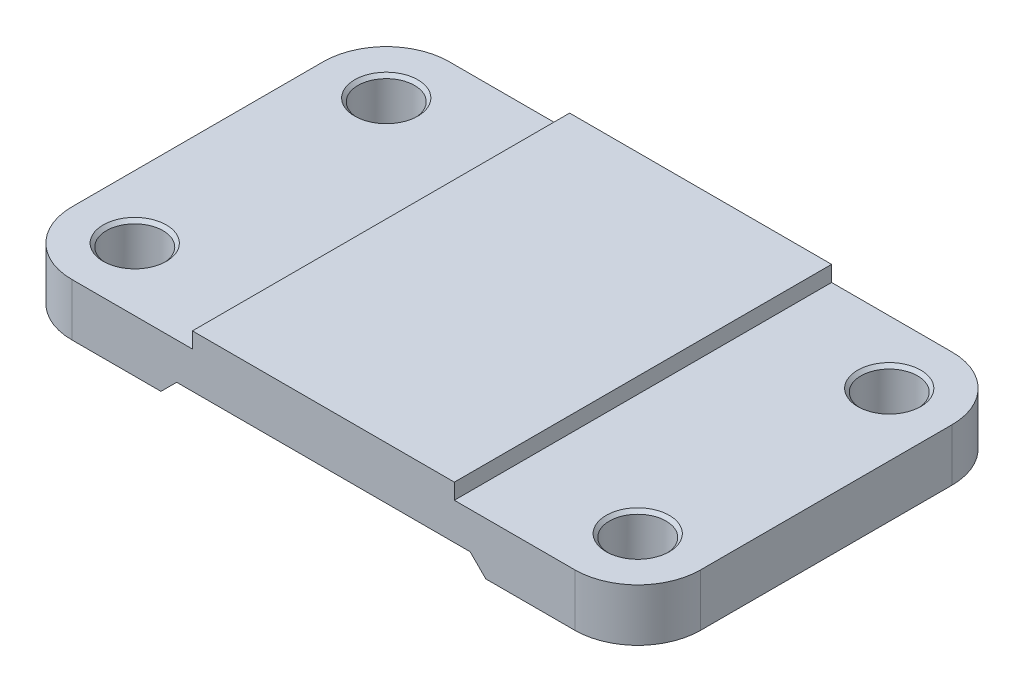
ISO-10303-21;
HEADER;
FILE_DESCRIPTION(('STEP AP214'),'2;1');
FILE_NAME('part.step','',(''),(''),'','','');
FILE_SCHEMA(('AUTOMOTIVE_DESIGN { 1 0 10303 214 1 1 1 1 }'));
ENDSEC;
DATA;
#1=APPLICATION_CONTEXT('core data for automotive mechanical design processes');
#2=APPLICATION_PROTOCOL_DEFINITION('international standard','automotive_design',2000,#1);
#3=PRODUCT_CONTEXT('',#1,'mechanical');
#4=PRODUCT('Part','Part','',(#3));
#5=PRODUCT_RELATED_PRODUCT_CATEGORY('part','',(#4));
#6=PRODUCT_DEFINITION_FORMATION('','',#4);
#7=PRODUCT_DEFINITION_CONTEXT('part definition',#1,'design');
#8=PRODUCT_DEFINITION('design','',#6,#7);
#9=PRODUCT_DEFINITION_SHAPE('','',#8);
#10=(LENGTH_UNIT() NAMED_UNIT(*) SI_UNIT(.MILLI.,.METRE.));
#11=(NAMED_UNIT(*) PLANE_ANGLE_UNIT() SI_UNIT($,.RADIAN.));
#12=(NAMED_UNIT(*) SI_UNIT($,.STERADIAN.) SOLID_ANGLE_UNIT());
#13=UNCERTAINTY_MEASURE_WITH_UNIT(LENGTH_MEASURE(1.E-05),#10,'distance_accuracy_value','');
#14=(GEOMETRIC_REPRESENTATION_CONTEXT(3) GLOBAL_UNCERTAINTY_ASSIGNED_CONTEXT((#13)) GLOBAL_UNIT_ASSIGNED_CONTEXT((#10,
#11,#12)) REPRESENTATION_CONTEXT('',''));
#15=CARTESIAN_POINT('',(0.,0.,0.));
#16=DIRECTION('',(0.,0.,1.));
#17=DIRECTION('',(1.,0.,0.));
#18=AXIS2_PLACEMENT_3D('',#15,#16,#17);
#19=CARTESIAN_POINT('',(-28.,3.00000000000001,36.));
#20=DIRECTION('',(0.,1.,0.));
#21=DIRECTION('',(0.,0.,1.));
#22=AXIS2_PLACEMENT_3D('',#19,#20,#21);
#23=PLANE('',#22);
#24=DIRECTION('',(1.,0.,0.));
#25=VECTOR('',#24,1.);
#26=CARTESIAN_POINT('',(-28.,3.00000000000001,-36.));
#27=LINE('',#26,#25);
#28=CARTESIAN_POINT('',(-28.,3.00000000000001,-36.));
#29=VERTEX_POINT('',#28);
#30=CARTESIAN_POINT('',(28.,3.00000000000001,-36.));
#31=VERTEX_POINT('',#30);
#32=EDGE_CURVE('E191',#29,#31,#27,.T.);
#33=ORIENTED_EDGE('',*,*,#32,.T.);
#34=DIRECTION('',(0.,0.,-1.));
#35=VECTOR('',#34,1.);
#36=CARTESIAN_POINT('',(28.,3.00000000000001,36.));
#37=LINE('',#36,#35);
#38=CARTESIAN_POINT('',(28.,3.00000000000001,36.));
#39=VERTEX_POINT('',#38);
#40=EDGE_CURVE('E171',#39,#31,#37,.T.);
#41=ORIENTED_EDGE('',*,*,#40,.F.);
#42=DIRECTION('',(1.,0.,0.));
#43=VECTOR('',#42,1.);
#44=CARTESIAN_POINT('',(-28.,3.00000000000001,36.));
#45=LINE('',#44,#43);
#46=CARTESIAN_POINT('',(-28.,3.00000000000001,36.));
#47=VERTEX_POINT('',#46);
#48=EDGE_CURVE('E178',#47,#39,#45,.T.);
#49=ORIENTED_EDGE('',*,*,#48,.F.);
#50=DIRECTION('',(0.,0.,-1.));
#51=VECTOR('',#50,1.);
#52=CARTESIAN_POINT('',(-28.,3.00000000000001,36.));
#53=LINE('',#52,#51);
#54=EDGE_CURVE('E307',#47,#29,#53,.T.);
#55=ORIENTED_EDGE('',*,*,#54,.T.);
#56=EDGE_LOOP('',(#33,#41,#49,#55));
#57=FACE_BOUND('',#56,.T.);
#58=ADVANCED_FACE('F49',(#57),#23,.F.);
#59=CARTESIAN_POINT('',(28.,3.00000000000001,36.));
#60=DIRECTION('',(0.707106781186549,0.707106781186546,0.));
#61=DIRECTION('',(-0.707106781186546,0.707106781186549,0.));
#62=AXIS2_PLACEMENT_3D('',#59,#60,#61);
#63=PLANE('',#62);
#64=DIRECTION('',(0.707106781186546,-0.707106781186549,0.));
#65=VECTOR('',#64,1.);
#66=CARTESIAN_POINT('',(28.,3.00000000000001,-36.));
#67=LINE('',#66,#65);
#68=CARTESIAN_POINT('',(31.,0.,-36.));
#69=VERTEX_POINT('',#68);
#70=EDGE_CURVE('E310',#31,#69,#67,.T.);
#71=ORIENTED_EDGE('',*,*,#70,.T.);
#72=DIRECTION('',(0.,0.,-1.));
#73=VECTOR('',#72,1.);
#74=CARTESIAN_POINT('',(31.,0.,36.));
#75=LINE('',#74,#73);
#76=CARTESIAN_POINT('',(31.,0.,36.));
#77=VERTEX_POINT('',#76);
#78=EDGE_CURVE('E174',#77,#69,#75,.T.);
#79=ORIENTED_EDGE('',*,*,#78,.F.);
#80=DIRECTION('',(0.707106781186546,-0.707106781186549,0.));
#81=VECTOR('',#80,1.);
#82=CARTESIAN_POINT('',(28.,3.00000000000001,36.));
#83=LINE('',#82,#81);
#84=EDGE_CURVE('E167',#39,#77,#83,.T.);
#85=ORIENTED_EDGE('',*,*,#84,.F.);
#86=ORIENTED_EDGE('',*,*,#40,.T.);
#87=EDGE_LOOP('',(#71,#79,#85,#86));
#88=FACE_BOUND('',#87,.T.);
#89=ADVANCED_FACE('F169',(#88),#63,.F.);
#90=CARTESIAN_POINT('',(31.,0.,36.));
#91=DIRECTION('',(0.,1.,0.));
#92=DIRECTION('',(-1.,0.,0.));
#93=AXIS2_PLACEMENT_3D('',#90,#91,#92);
#94=PLANE('',#93);
#95=CARTESIAN_POINT('',(48.,0.,24.));
#96=DIRECTION('',(0.,1.,0.));
#97=DIRECTION('',(-1.,0.,0.));
#98=AXIS2_PLACEMENT_3D('',#95,#96,#97);
#99=CIRCLE('',#98,5.4);
#100=CARTESIAN_POINT('',(42.6,0.,24.));
#101=VERTEX_POINT('',#100);
#102=EDGE_CURVE('E249',#101,#101,#99,.T.);
#103=ORIENTED_EDGE('',*,*,#102,.T.);
#104=EDGE_LOOP('',(#103));
#105=FACE_BOUND('',#104,.T.);
#106=CARTESIAN_POINT('',(48.,0.,-24.));
#107=DIRECTION('',(0.,1.,0.));
#108=DIRECTION('',(-1.,0.,0.));
#109=AXIS2_PLACEMENT_3D('',#106,#107,#108);
#110=CIRCLE('',#109,5.4);
#111=CARTESIAN_POINT('',(42.6,0.,-24.));
#112=VERTEX_POINT('',#111);
#113=EDGE_CURVE('E244',#112,#112,#110,.T.);
#114=ORIENTED_EDGE('',*,*,#113,.T.);
#115=EDGE_LOOP('',(#114));
#116=FACE_BOUND('',#115,.T.);
#117=DIRECTION('',(1.,0.,0.));
#118=VECTOR('',#117,1.);
#119=CARTESIAN_POINT('',(31.,0.,-36.));
#120=LINE('',#119,#118);
#121=CARTESIAN_POINT('',(48.,0.,-36.));
#122=VERTEX_POINT('',#121);
#123=EDGE_CURVE('E313',#69,#122,#120,.T.);
#124=ORIENTED_EDGE('',*,*,#123,.T.);
#125=CARTESIAN_POINT('',(48.,0.,-24.));
#126=DIRECTION('',(0.,1.,0.));
#127=DIRECTION('',(-1.,0.,0.));
#128=AXIS2_PLACEMENT_3D('',#125,#126,#127);
#129=CIRCLE('',#128,12.);
#130=CARTESIAN_POINT('',(60.,0.,-24.));
#131=VERTEX_POINT('',#130);
#132=EDGE_CURVE('E238',#122,#131,#129,.F.);
#133=ORIENTED_EDGE('',*,*,#132,.T.);
#134=DIRECTION('',(0.,0.,-1.));
#135=VECTOR('',#134,1.);
#136=CARTESIAN_POINT('',(60.,0.,36.));
#137=LINE('',#136,#135);
#138=CARTESIAN_POINT('',(60.,0.,24.));
#139=VERTEX_POINT('',#138);
#140=EDGE_CURVE('E199',#139,#131,#137,.T.);
#141=ORIENTED_EDGE('',*,*,#140,.F.);
#142=CARTESIAN_POINT('',(48.,0.,24.));
#143=DIRECTION('',(0.,1.,0.));
#144=DIRECTION('',(-1.,0.,0.));
#145=AXIS2_PLACEMENT_3D('',#142,#143,#144);
#146=CIRCLE('',#145,12.);
#147=CARTESIAN_POINT('',(48.,0.,36.));
#148=VERTEX_POINT('',#147);
#149=EDGE_CURVE('E67',#139,#148,#146,.F.);
#150=ORIENTED_EDGE('',*,*,#149,.T.);
#151=DIRECTION('',(1.,0.,0.));
#152=VECTOR('',#151,1.);
#153=CARTESIAN_POINT('',(31.,0.,36.));
#154=LINE('',#153,#152);
#155=EDGE_CURVE('E177',#77,#148,#154,.T.);
#156=ORIENTED_EDGE('',*,*,#155,.F.);
#157=ORIENTED_EDGE('',*,*,#78,.T.);
#158=EDGE_LOOP('',(#124,#133,#141,#150,#156,#157));
#159=FACE_BOUND('',#158,.T.);
#160=ADVANCED_FACE('F418',(#105,#116,#159),#94,.F.);
#161=CARTESIAN_POINT('',(60.,0.,36.));
#162=DIRECTION('',(-1.,0.,0.));
#163=DIRECTION('',(0.,0.,1.));
#164=AXIS2_PLACEMENT_3D('',#161,#162,#163);
#165=PLANE('',#164);
#166=ORIENTED_EDGE('',*,*,#140,.T.);
#167=DIRECTION('',(0.,1.,0.));
#168=VECTOR('',#167,1.);
#169=CARTESIAN_POINT('',(60.,0.,-24.));
#170=LINE('',#169,#168);
#171=CARTESIAN_POINT('',(60.,9.99999999999999,-24.));
#172=VERTEX_POINT('',#171);
#173=EDGE_CURVE('E227',#131,#172,#170,.T.);
#174=ORIENTED_EDGE('',*,*,#173,.T.);
#175=DIRECTION('',(0.,0.,-1.));
#176=VECTOR('',#175,1.);
#177=CARTESIAN_POINT('',(60.,9.99999999999999,36.));
#178=LINE('',#177,#176);
#179=CARTESIAN_POINT('',(60.,9.99999999999999,24.));
#180=VERTEX_POINT('',#179);
#181=EDGE_CURVE('E368',#180,#172,#178,.T.);
#182=ORIENTED_EDGE('',*,*,#181,.F.);
#183=DIRECTION('',(0.,1.,0.));
#184=VECTOR('',#183,1.);
#185=CARTESIAN_POINT('',(60.,0.,24.));
#186=LINE('',#185,#184);
#187=EDGE_CURVE('E224',#180,#139,#186,.F.);
#188=ORIENTED_EDGE('',*,*,#187,.T.);
#189=EDGE_LOOP('',(#166,#174,#182,#188));
#190=FACE_BOUND('',#189,.T.);
#191=ADVANCED_FACE('F375',(#190),#165,.F.);
#192=CARTESIAN_POINT('',(60.,9.99999999999999,36.));
#193=DIRECTION('',(0.,-1.,0.));
#194=DIRECTION('',(1.,0.,0.));
#195=AXIS2_PLACEMENT_3D('',#192,#193,#194);
#196=PLANE('',#195);
#197=CARTESIAN_POINT('',(48.,10.,24.));
#198=DIRECTION('',(0.,1.,0.));
#199=DIRECTION('',(0.,0.,1.));
#200=AXIS2_PLACEMENT_3D('',#197,#198,#199);
#201=CIRCLE('',#200,6.025);
#202=CARTESIAN_POINT('',(48.,10.,30.025));
#203=VERTEX_POINT('',#202);
#204=EDGE_CURVE('E257',#203,#203,#201,.T.);
#205=ORIENTED_EDGE('',*,*,#204,.F.);
#206=EDGE_LOOP('',(#205));
#207=FACE_BOUND('',#206,.T.);
#208=CARTESIAN_POINT('',(48.,10.,-24.));
#209=DIRECTION('',(0.,1.,0.));
#210=DIRECTION('',(0.,0.,1.));
#211=AXIS2_PLACEMENT_3D('',#208,#209,#210);
#212=CIRCLE('',#211,6.025);
#213=CARTESIAN_POINT('',(48.,10.,-17.975));
#214=VERTEX_POINT('',#213);
#215=EDGE_CURVE('E252',#214,#214,#212,.T.);
#216=ORIENTED_EDGE('',*,*,#215,.F.);
#217=EDGE_LOOP('',(#216));
#218=FACE_BOUND('',#217,.T.);
#219=ORIENTED_EDGE('',*,*,#181,.T.);
#220=CARTESIAN_POINT('',(48.,9.99999999999999,-24.));
#221=DIRECTION('',(0.,-1.,0.));
#222=DIRECTION('',(1.,0.,0.));
#223=AXIS2_PLACEMENT_3D('',#220,#221,#222);
#224=CIRCLE('',#223,12.);
#225=CARTESIAN_POINT('',(48.,9.99999999999999,-36.));
#226=VERTEX_POINT('',#225);
#227=EDGE_CURVE('E233',#172,#226,#224,.F.);
#228=ORIENTED_EDGE('',*,*,#227,.T.);
#229=DIRECTION('',(-1.,0.,0.));
#230=VECTOR('',#229,1.);
#231=CARTESIAN_POINT('',(60.,9.99999999999999,-36.));
#232=LINE('',#231,#230);
#233=CARTESIAN_POINT('',(25.,9.99999999999999,-36.));
#234=VERTEX_POINT('',#233);
#235=EDGE_CURVE('E317',#226,#234,#232,.T.);
#236=ORIENTED_EDGE('',*,*,#235,.T.);
#237=DIRECTION('',(0.,0.,-1.));
#238=VECTOR('',#237,1.);
#239=CARTESIAN_POINT('',(25.,9.99999999999999,36.));
#240=LINE('',#239,#238);
#241=CARTESIAN_POINT('',(25.,9.99999999999999,36.));
#242=VERTEX_POINT('',#241);
#243=EDGE_CURVE('E364',#242,#234,#240,.T.);
#244=ORIENTED_EDGE('',*,*,#243,.F.);
#245=DIRECTION('',(-1.,0.,0.));
#246=VECTOR('',#245,1.);
#247=CARTESIAN_POINT('',(60.,9.99999999999999,36.));
#248=LINE('',#247,#246);
#249=CARTESIAN_POINT('',(48.,9.99999999999999,36.));
#250=VERTEX_POINT('',#249);
#251=EDGE_CURVE('E286',#250,#242,#248,.T.);
#252=ORIENTED_EDGE('',*,*,#251,.F.);
#253=CARTESIAN_POINT('',(48.,9.99999999999999,24.));
#254=DIRECTION('',(0.,-1.,0.));
#255=DIRECTION('',(1.,0.,0.));
#256=AXIS2_PLACEMENT_3D('',#253,#254,#255);
#257=CIRCLE('',#256,12.);
#258=EDGE_CURVE('E75',#250,#180,#257,.F.);
#259=ORIENTED_EDGE('',*,*,#258,.T.);
#260=EDGE_LOOP('',(#219,#228,#236,#244,#252,#259));
#261=FACE_BOUND('',#260,.T.);
#262=ADVANCED_FACE('F383',(#207,#218,#261),#196,.F.);
#263=CARTESIAN_POINT('',(25.,9.99999999999999,36.));
#264=DIRECTION('',(-1.,0.,0.));
#265=DIRECTION('',(0.,0.,1.));
#266=AXIS2_PLACEMENT_3D('',#263,#264,#265);
#267=PLANE('',#266);
#268=DIRECTION('',(0.,1.,0.));
#269=VECTOR('',#268,1.);
#270=CARTESIAN_POINT('',(25.,9.99999999999999,-36.));
#271=LINE('',#270,#269);
#272=CARTESIAN_POINT('',(25.,13.,-36.));
#273=VERTEX_POINT('',#272);
#274=EDGE_CURVE('E320',#234,#273,#271,.T.);
#275=ORIENTED_EDGE('',*,*,#274,.T.);
#276=DIRECTION('',(0.,0.,-1.));
#277=VECTOR('',#276,1.);
#278=CARTESIAN_POINT('',(25.,13.,36.));
#279=LINE('',#278,#277);
#280=CARTESIAN_POINT('',(25.,13.,36.));
#281=VERTEX_POINT('',#280);
#282=EDGE_CURVE('E360',#281,#273,#279,.T.);
#283=ORIENTED_EDGE('',*,*,#282,.F.);
#284=DIRECTION('',(0.,1.,0.));
#285=VECTOR('',#284,1.);
#286=CARTESIAN_POINT('',(25.,9.99999999999999,36.));
#287=LINE('',#286,#285);
#288=EDGE_CURVE('E289',#242,#281,#287,.T.);
#289=ORIENTED_EDGE('',*,*,#288,.F.);
#290=ORIENTED_EDGE('',*,*,#243,.T.);
#291=EDGE_LOOP('',(#275,#283,#289,#290));
#292=FACE_BOUND('',#291,.T.);
#293=ADVANCED_FACE('F394',(#292),#267,.F.);
#294=CARTESIAN_POINT('',(-25.,13.,36.));
#295=DIRECTION('',(0.,-1.,0.));
#296=DIRECTION('',(0.,0.,-1.));
#297=AXIS2_PLACEMENT_3D('',#294,#295,#296);
#298=PLANE('',#297);
#299=DIRECTION('',(-1.,0.,0.));
#300=VECTOR('',#299,1.);
#301=CARTESIAN_POINT('',(-25.,13.,-36.));
#302=LINE('',#301,#300);
#303=CARTESIAN_POINT('',(-25.,13.,-36.));
#304=VERTEX_POINT('',#303);
#305=EDGE_CURVE('E323',#273,#304,#302,.T.);
#306=ORIENTED_EDGE('',*,*,#305,.T.);
#307=DIRECTION('',(0.,0.,-1.));
#308=VECTOR('',#307,1.);
#309=CARTESIAN_POINT('',(-25.,13.,36.));
#310=LINE('',#309,#308);
#311=CARTESIAN_POINT('',(-25.,13.,36.));
#312=VERTEX_POINT('',#311);
#313=EDGE_CURVE('E356',#312,#304,#310,.T.);
#314=ORIENTED_EDGE('',*,*,#313,.F.);
#315=DIRECTION('',(-1.,0.,0.));
#316=VECTOR('',#315,1.);
#317=CARTESIAN_POINT('',(-25.,13.,36.));
#318=LINE('',#317,#316);
#319=EDGE_CURVE('E292',#281,#312,#318,.T.);
#320=ORIENTED_EDGE('',*,*,#319,.F.);
#321=ORIENTED_EDGE('',*,*,#282,.T.);
#322=EDGE_LOOP('',(#306,#314,#320,#321));
#323=FACE_BOUND('',#322,.T.);
#324=ADVANCED_FACE('F398',(#323),#298,.F.);
#325=CARTESIAN_POINT('',(-25.,9.99999999999999,36.));
#326=DIRECTION('',(1.,0.,0.));
#327=DIRECTION('',(0.,0.,-1.));
#328=AXIS2_PLACEMENT_3D('',#325,#326,#327);
#329=PLANE('',#328);
#330=DIRECTION('',(0.,-1.,0.));
#331=VECTOR('',#330,1.);
#332=CARTESIAN_POINT('',(-25.,9.99999999999999,-36.));
#333=LINE('',#332,#331);
#334=CARTESIAN_POINT('',(-25.,9.99999999999999,-36.));
#335=VERTEX_POINT('',#334);
#336=EDGE_CURVE('E326',#304,#335,#333,.T.);
#337=ORIENTED_EDGE('',*,*,#336,.T.);
#338=DIRECTION('',(0.,0.,-1.));
#339=VECTOR('',#338,1.);
#340=CARTESIAN_POINT('',(-25.,9.99999999999999,36.));
#341=LINE('',#340,#339);
#342=CARTESIAN_POINT('',(-25.,9.99999999999999,36.));
#343=VERTEX_POINT('',#342);
#344=EDGE_CURVE('E352',#343,#335,#341,.T.);
#345=ORIENTED_EDGE('',*,*,#344,.F.);
#346=DIRECTION('',(0.,-1.,0.));
#347=VECTOR('',#346,1.);
#348=CARTESIAN_POINT('',(-25.,9.99999999999999,36.));
#349=LINE('',#348,#347);
#350=EDGE_CURVE('E295',#312,#343,#349,.T.);
#351=ORIENTED_EDGE('',*,*,#350,.F.);
#352=ORIENTED_EDGE('',*,*,#313,.T.);
#353=EDGE_LOOP('',(#337,#345,#351,#352));
#354=FACE_BOUND('',#353,.T.);
#355=ADVANCED_FACE('F464',(#354),#329,.F.);
#356=CARTESIAN_POINT('',(-60.,9.99999999999999,36.));
#357=DIRECTION('',(0.,-1.,0.));
#358=DIRECTION('',(1.,0.,0.));
#359=AXIS2_PLACEMENT_3D('',#356,#357,#358);
#360=PLANE('',#359);
#361=CARTESIAN_POINT('',(-48.,9.99999999999999,-24.));
#362=DIRECTION('',(0.,1.,0.));
#363=DIRECTION('',(0.,0.,1.));
#364=AXIS2_PLACEMENT_3D('',#361,#362,#363);
#365=CIRCLE('',#364,6.025);
#366=CARTESIAN_POINT('',(-48.,9.99999999999999,-17.975));
#367=VERTEX_POINT('',#366);
#368=EDGE_CURVE('E518',#367,#367,#365,.T.);
#369=ORIENTED_EDGE('',*,*,#368,.F.);
#370=EDGE_LOOP('',(#369));
#371=FACE_BOUND('',#370,.T.);
#372=CARTESIAN_POINT('',(-48.,9.99999999999999,24.));
#373=DIRECTION('',(0.,1.,0.));
#374=DIRECTION('',(0.,0.,1.));
#375=AXIS2_PLACEMENT_3D('',#372,#373,#374);
#376=CIRCLE('',#375,6.025);
#377=CARTESIAN_POINT('',(-48.,9.99999999999999,30.025));
#378=VERTEX_POINT('',#377);
#379=EDGE_CURVE('E266',#378,#378,#376,.T.);
#380=ORIENTED_EDGE('',*,*,#379,.F.);
#381=EDGE_LOOP('',(#380));
#382=FACE_BOUND('',#381,.T.);
#383=DIRECTION('',(-1.,0.,0.));
#384=VECTOR('',#383,1.);
#385=CARTESIAN_POINT('',(-60.,9.99999999999999,-36.));
#386=LINE('',#385,#384);
#387=CARTESIAN_POINT('',(-48.,9.99999999999999,-36.));
#388=VERTEX_POINT('',#387);
#389=EDGE_CURVE('E329',#335,#388,#386,.T.);
#390=ORIENTED_EDGE('',*,*,#389,.T.);
#391=CARTESIAN_POINT('',(-48.,9.99999999999999,-24.));
#392=DIRECTION('',(0.,-1.,0.));
#393=DIRECTION('',(1.,0.,0.));
#394=AXIS2_PLACEMENT_3D('',#391,#392,#393);
#395=CIRCLE('',#394,12.);
#396=CARTESIAN_POINT('',(-60.,9.99999999999999,-24.));
#397=VERTEX_POINT('',#396);
#398=EDGE_CURVE('E221',#388,#397,#395,.F.);
#399=ORIENTED_EDGE('',*,*,#398,.T.);
#400=DIRECTION('',(0.,0.,-1.));
#401=VECTOR('',#400,1.);
#402=CARTESIAN_POINT('',(-60.,9.99999999999999,36.));
#403=LINE('',#402,#401);
#404=CARTESIAN_POINT('',(-60.,9.99999999999999,24.));
#405=VERTEX_POINT('',#404);
#406=EDGE_CURVE('E348',#405,#397,#403,.T.);
#407=ORIENTED_EDGE('',*,*,#406,.F.);
#408=CARTESIAN_POINT('',(-48.,9.99999999999999,24.));
#409=DIRECTION('',(0.,-1.,0.));
#410=DIRECTION('',(1.,0.,0.));
#411=AXIS2_PLACEMENT_3D('',#408,#409,#410);
#412=CIRCLE('',#411,12.);
#413=CARTESIAN_POINT('',(-48.,9.99999999999999,36.));
#414=VERTEX_POINT('',#413);
#415=EDGE_CURVE('E218',#405,#414,#412,.F.);
#416=ORIENTED_EDGE('',*,*,#415,.T.);
#417=DIRECTION('',(-1.,0.,0.));
#418=VECTOR('',#417,1.);
#419=CARTESIAN_POINT('',(-60.,9.99999999999999,36.));
#420=LINE('',#419,#418);
#421=EDGE_CURVE('E298',#343,#414,#420,.T.);
#422=ORIENTED_EDGE('',*,*,#421,.F.);
#423=ORIENTED_EDGE('',*,*,#344,.T.);
#424=EDGE_LOOP('',(#390,#399,#407,#416,#422,#423));
#425=FACE_BOUND('',#424,.T.);
#426=ADVANCED_FACE('F433',(#371,#382,#425),#360,.F.);
#427=CARTESIAN_POINT('',(-60.,0.,36.));
#428=DIRECTION('',(1.,0.,0.));
#429=DIRECTION('',(0.,0.,-1.));
#430=AXIS2_PLACEMENT_3D('',#427,#428,#429);
#431=PLANE('',#430);
#432=ORIENTED_EDGE('',*,*,#406,.T.);
#433=DIRECTION('',(0.,-1.,0.));
#434=VECTOR('',#433,1.);
#435=CARTESIAN_POINT('',(-60.,0.,-24.));
#436=LINE('',#435,#434);
#437=CARTESIAN_POINT('',(-60.,0.,-24.));
#438=VERTEX_POINT('',#437);
#439=EDGE_CURVE('E197',#397,#438,#436,.T.);
#440=ORIENTED_EDGE('',*,*,#439,.T.);
#441=DIRECTION('',(0.,0.,-1.));
#442=VECTOR('',#441,1.);
#443=CARTESIAN_POINT('',(-60.,0.,36.));
#444=LINE('',#443,#442);
#445=CARTESIAN_POINT('',(-60.,0.,24.));
#446=VERTEX_POINT('',#445);
#447=EDGE_CURVE('E344',#446,#438,#444,.T.);
#448=ORIENTED_EDGE('',*,*,#447,.F.);
#449=DIRECTION('',(0.,-1.,0.));
#450=VECTOR('',#449,1.);
#451=CARTESIAN_POINT('',(-60.,9.99999999999999,24.));
#452=LINE('',#451,#450);
#453=EDGE_CURVE('E193',#446,#405,#452,.F.);
#454=ORIENTED_EDGE('',*,*,#453,.T.);
#455=EDGE_LOOP('',(#432,#440,#448,#454));
#456=FACE_BOUND('',#455,.T.);
#457=ADVANCED_FACE('F437',(#456),#431,.F.);
#458=CARTESIAN_POINT('',(-31.,0.,36.));
#459=DIRECTION('',(0.,1.,0.));
#460=DIRECTION('',(-1.,0.,0.));
#461=AXIS2_PLACEMENT_3D('',#458,#459,#460);
#462=PLANE('',#461);
#463=CARTESIAN_POINT('',(-48.,0.,-24.));
#464=DIRECTION('',(0.,1.,0.));
#465=DIRECTION('',(-1.,0.,0.));
#466=AXIS2_PLACEMENT_3D('',#463,#464,#465);
#467=CIRCLE('',#466,5.4);
#468=CARTESIAN_POINT('',(-53.4,0.,-24.));
#469=VERTEX_POINT('',#468);
#470=EDGE_CURVE('E53',#469,#469,#467,.T.);
#471=ORIENTED_EDGE('',*,*,#470,.T.);
#472=EDGE_LOOP('',(#471));
#473=FACE_BOUND('',#472,.T.);
#474=CARTESIAN_POINT('',(-48.,0.,24.));
#475=DIRECTION('',(0.,1.,0.));
#476=DIRECTION('',(-1.,0.,0.));
#477=AXIS2_PLACEMENT_3D('',#474,#475,#476);
#478=CIRCLE('',#477,5.4);
#479=CARTESIAN_POINT('',(-53.4,0.,24.));
#480=VERTEX_POINT('',#479);
#481=EDGE_CURVE('E254',#480,#480,#478,.T.);
#482=ORIENTED_EDGE('',*,*,#481,.T.);
#483=EDGE_LOOP('',(#482));
#484=FACE_BOUND('',#483,.T.);
#485=ORIENTED_EDGE('',*,*,#447,.T.);
#486=CARTESIAN_POINT('',(-48.,0.,-24.));
#487=DIRECTION('',(0.,1.,0.));
#488=DIRECTION('',(-1.,0.,0.));
#489=AXIS2_PLACEMENT_3D('',#486,#487,#488);
#490=CIRCLE('',#489,12.);
#491=CARTESIAN_POINT('',(-48.,0.,-36.));
#492=VERTEX_POINT('',#491);
#493=EDGE_CURVE('E209',#438,#492,#490,.F.);
#494=ORIENTED_EDGE('',*,*,#493,.T.);
#495=DIRECTION('',(1.,0.,0.));
#496=VECTOR('',#495,1.);
#497=CARTESIAN_POINT('',(-31.,0.,-36.));
#498=LINE('',#497,#496);
#499=CARTESIAN_POINT('',(-31.,0.,-36.));
#500=VERTEX_POINT('',#499);
#501=EDGE_CURVE('E333',#492,#500,#498,.T.);
#502=ORIENTED_EDGE('',*,*,#501,.T.);
#503=DIRECTION('',(0.,0.,-1.));
#504=VECTOR('',#503,1.);
#505=CARTESIAN_POINT('',(-31.,0.,36.));
#506=LINE('',#505,#504);
#507=CARTESIAN_POINT('',(-31.,0.,36.));
#508=VERTEX_POINT('',#507);
#509=EDGE_CURVE('E340',#508,#500,#506,.T.);
#510=ORIENTED_EDGE('',*,*,#509,.F.);
#511=DIRECTION('',(1.,0.,0.));
#512=VECTOR('',#511,1.);
#513=CARTESIAN_POINT('',(-31.,0.,36.));
#514=LINE('',#513,#512);
#515=CARTESIAN_POINT('',(-48.,0.,36.));
#516=VERTEX_POINT('',#515);
#517=EDGE_CURVE('E302',#516,#508,#514,.T.);
#518=ORIENTED_EDGE('',*,*,#517,.F.);
#519=CARTESIAN_POINT('',(-48.,0.,24.));
#520=DIRECTION('',(0.,1.,0.));
#521=DIRECTION('',(-1.,0.,0.));
#522=AXIS2_PLACEMENT_3D('',#519,#520,#521);
#523=CIRCLE('',#522,12.);
#524=EDGE_CURVE('E206',#516,#446,#523,.F.);
#525=ORIENTED_EDGE('',*,*,#524,.T.);
#526=EDGE_LOOP('',(#485,#494,#502,#510,#518,#525));
#527=FACE_BOUND('',#526,.T.);
#528=ADVANCED_FACE('F445',(#473,#484,#527),#462,.F.);
#529=CARTESIAN_POINT('',(-28.,3.00000000000001,36.));
#530=DIRECTION('',(-0.707106781186549,0.707106781186546,0.));
#531=DIRECTION('',(-0.707106781186546,-0.707106781186549,0.));
#532=AXIS2_PLACEMENT_3D('',#529,#530,#531);
#533=PLANE('',#532);
#534=DIRECTION('',(0.707106781186546,0.707106781186549,0.));
#535=VECTOR('',#534,1.);
#536=CARTESIAN_POINT('',(-28.,3.00000000000001,-36.));
#537=LINE('',#536,#535);
#538=EDGE_CURVE('E188',#500,#29,#537,.T.);
#539=ORIENTED_EDGE('',*,*,#538,.T.);
#540=ORIENTED_EDGE('',*,*,#54,.F.);
#541=DIRECTION('',(0.707106781186546,0.707106781186549,0.));
#542=VECTOR('',#541,1.);
#543=CARTESIAN_POINT('',(-28.,3.00000000000001,36.));
#544=LINE('',#543,#542);
#545=EDGE_CURVE('E183',#508,#47,#544,.T.);
#546=ORIENTED_EDGE('',*,*,#545,.F.);
#547=ORIENTED_EDGE('',*,*,#509,.T.);
#548=EDGE_LOOP('',(#539,#540,#546,#547));
#549=FACE_BOUND('',#548,.T.);
#550=ADVANCED_FACE('F448',(#549),#533,.F.);
#551=CARTESIAN_POINT('',(0.,0.,36.));
#552=DIRECTION('',(0.,0.,1.));
#553=DIRECTION('',(1.,0.,0.));
#554=AXIS2_PLACEMENT_3D('',#551,#552,#553);
#555=PLANE('',#554);
#556=ORIENTED_EDGE('',*,*,#155,.T.);
#557=DIRECTION('',(0.,1.,0.));
#558=VECTOR('',#557,1.);
#559=CARTESIAN_POINT('',(48.,9.99999999999999,36.));
#560=LINE('',#559,#558);
#561=EDGE_CURVE('E11',#148,#250,#560,.T.);
#562=ORIENTED_EDGE('',*,*,#561,.T.);
#563=ORIENTED_EDGE('',*,*,#251,.T.);
#564=ORIENTED_EDGE('',*,*,#288,.T.);
#565=ORIENTED_EDGE('',*,*,#319,.T.);
#566=ORIENTED_EDGE('',*,*,#350,.T.);
#567=ORIENTED_EDGE('',*,*,#421,.T.);
#568=DIRECTION('',(0.,-1.,0.));
#569=VECTOR('',#568,1.);
#570=CARTESIAN_POINT('',(-48.,0.,36.));
#571=LINE('',#570,#569);
#572=EDGE_CURVE('E59',#414,#516,#571,.T.);
#573=ORIENTED_EDGE('',*,*,#572,.T.);
#574=ORIENTED_EDGE('',*,*,#517,.T.);
#575=ORIENTED_EDGE('',*,*,#545,.T.);
#576=ORIENTED_EDGE('',*,*,#48,.T.);
#577=ORIENTED_EDGE('',*,*,#84,.T.);
#578=EDGE_LOOP('',(#556,#562,#563,#564,#565,#566,#567,#573,#574,#575,#576,#577));
#579=FACE_BOUND('',#578,.T.);
#580=ADVANCED_FACE('F181',(#579),#555,.T.);
#581=CARTESIAN_POINT('',(0.,0.,-36.));
#582=DIRECTION('',(0.,0.,1.));
#583=DIRECTION('',(1.,0.,0.));
#584=AXIS2_PLACEMENT_3D('',#581,#582,#583);
#585=PLANE('',#584);
#586=ORIENTED_EDGE('',*,*,#501,.F.);
#587=DIRECTION('',(0.,-1.,0.));
#588=VECTOR('',#587,1.);
#589=CARTESIAN_POINT('',(-48.,0.,-36.));
#590=LINE('',#589,#588);
#591=EDGE_CURVE('E215',#492,#388,#590,.F.);
#592=ORIENTED_EDGE('',*,*,#591,.T.);
#593=ORIENTED_EDGE('',*,*,#389,.F.);
#594=ORIENTED_EDGE('',*,*,#336,.F.);
#595=ORIENTED_EDGE('',*,*,#305,.F.);
#596=ORIENTED_EDGE('',*,*,#274,.F.);
#597=ORIENTED_EDGE('',*,*,#235,.F.);
#598=DIRECTION('',(0.,1.,0.));
#599=VECTOR('',#598,1.);
#600=CARTESIAN_POINT('',(48.,0.,-36.));
#601=LINE('',#600,#599);
#602=EDGE_CURVE('E212',#226,#122,#601,.F.);
#603=ORIENTED_EDGE('',*,*,#602,.T.);
#604=ORIENTED_EDGE('',*,*,#123,.F.);
#605=ORIENTED_EDGE('',*,*,#70,.F.);
#606=ORIENTED_EDGE('',*,*,#32,.F.);
#607=ORIENTED_EDGE('',*,*,#538,.F.);
#608=EDGE_LOOP('',(#586,#592,#593,#594,#595,#596,#597,#603,#604,#605,#606,#607));
#609=FACE_BOUND('',#608,.T.);
#610=ADVANCED_FACE('F388',(#609),#585,.F.);
#611=CARTESIAN_POINT('',(-48.,0.,-24.));
#612=DIRECTION('',(0.,-1.,0.));
#613=DIRECTION('',(0.,0.,-1.));
#614=AXIS2_PLACEMENT_3D('',#611,#612,#613);
#615=CYLINDRICAL_SURFACE('',#614,12.);
#616=ORIENTED_EDGE('',*,*,#398,.F.);
#617=ORIENTED_EDGE('',*,*,#591,.F.);
#618=ORIENTED_EDGE('',*,*,#493,.F.);
#619=ORIENTED_EDGE('',*,*,#439,.F.);
#620=EDGE_LOOP('',(#616,#617,#618,#619));
#621=FACE_BOUND('',#620,.T.);
#622=ADVANCED_FACE('F411',(#621),#615,.T.);
#623=CARTESIAN_POINT('',(48.,0.,-24.));
#624=DIRECTION('',(0.,1.,0.));
#625=DIRECTION('',(0.,0.,1.));
#626=AXIS2_PLACEMENT_3D('',#623,#624,#625);
#627=CYLINDRICAL_SURFACE('',#626,12.);
#628=ORIENTED_EDGE('',*,*,#132,.F.);
#629=ORIENTED_EDGE('',*,*,#602,.F.);
#630=ORIENTED_EDGE('',*,*,#227,.F.);
#631=ORIENTED_EDGE('',*,*,#173,.F.);
#632=EDGE_LOOP('',(#628,#629,#630,#631));
#633=FACE_BOUND('',#632,.T.);
#634=ADVANCED_FACE('F379',(#633),#627,.T.);
#635=CARTESIAN_POINT('',(48.,0.,24.));
#636=DIRECTION('',(0.,-1.,0.));
#637=DIRECTION('',(0.,0.,-1.));
#638=AXIS2_PLACEMENT_3D('',#635,#636,#637);
#639=CYLINDRICAL_SURFACE('',#638,12.);
#640=ORIENTED_EDGE('',*,*,#149,.F.);
#641=ORIENTED_EDGE('',*,*,#187,.F.);
#642=ORIENTED_EDGE('',*,*,#258,.F.);
#643=ORIENTED_EDGE('',*,*,#561,.F.);
#644=EDGE_LOOP('',(#640,#641,#642,#643));
#645=FACE_BOUND('',#644,.T.);
#646=ADVANCED_FACE('F403',(#645),#639,.T.);
#647=CARTESIAN_POINT('',(-48.,0.,24.));
#648=DIRECTION('',(0.,1.,0.));
#649=DIRECTION('',(0.,0.,1.));
#650=AXIS2_PLACEMENT_3D('',#647,#648,#649);
#651=CYLINDRICAL_SURFACE('',#650,12.);
#652=ORIENTED_EDGE('',*,*,#415,.F.);
#653=ORIENTED_EDGE('',*,*,#453,.F.);
#654=ORIENTED_EDGE('',*,*,#524,.F.);
#655=ORIENTED_EDGE('',*,*,#572,.F.);
#656=EDGE_LOOP('',(#652,#653,#654,#655));
#657=FACE_BOUND('',#656,.T.);
#658=ADVANCED_FACE('F51',(#657),#651,.T.);
#659=CARTESIAN_POINT('',(48.,10.,-24.));
#660=DIRECTION('',(0.,1.,0.));
#661=DIRECTION('',(0.,0.,1.));
#662=AXIS2_PLACEMENT_3D('',#659,#660,#661);
#663=CYLINDRICAL_SURFACE('',#662,5.4);
#664=CARTESIAN_POINT('',(48.,9.37500000000001,-24.));
#665=DIRECTION('',(0.,1.,0.));
#666=DIRECTION('',(0.,0.,1.));
#667=AXIS2_PLACEMENT_3D('',#664,#665,#666);
#668=CIRCLE('',#667,5.4);
#669=CARTESIAN_POINT('',(48.,9.37500000000001,-18.6));
#670=VERTEX_POINT('',#669);
#671=EDGE_CURVE('E248',#670,#670,#668,.T.);
#672=ORIENTED_EDGE('',*,*,#671,.T.);
#673=EDGE_LOOP('',(#672));
#674=FACE_BOUND('',#673,.T.);
#675=ORIENTED_EDGE('',*,*,#113,.F.);
#676=EDGE_LOOP('',(#675));
#677=FACE_BOUND('',#676,.T.);
#678=ADVANCED_FACE('F409',(#674,#677),#663,.F.);
#679=CARTESIAN_POINT('',(48.,10.,-24.));
#680=DIRECTION('',(0.,1.,0.));
#681=DIRECTION('',(0.,0.,1.));
#682=AXIS2_PLACEMENT_3D('',#679,#680,#681);
#683=CONICAL_SURFACE('',#682,6.025,0.78539816339745);
#684=ORIENTED_EDGE('',*,*,#671,.F.);
#685=EDGE_LOOP('',(#684));
#686=FACE_BOUND('',#685,.T.);
#687=ORIENTED_EDGE('',*,*,#215,.T.);
#688=EDGE_LOOP('',(#687));
#689=FACE_BOUND('',#688,.T.);
#690=ADVANCED_FACE('F482',(#686,#689),#683,.F.);
#691=CARTESIAN_POINT('',(48.,10.,24.));
#692=DIRECTION('',(0.,1.,0.));
#693=DIRECTION('',(0.,0.,1.));
#694=AXIS2_PLACEMENT_3D('',#691,#692,#693);
#695=CYLINDRICAL_SURFACE('',#694,5.4);
#696=CARTESIAN_POINT('',(48.,9.37500000000001,24.));
#697=DIRECTION('',(0.,1.,0.));
#698=DIRECTION('',(0.,0.,1.));
#699=AXIS2_PLACEMENT_3D('',#696,#697,#698);
#700=CIRCLE('',#699,5.4);
#701=CARTESIAN_POINT('',(48.,9.37500000000001,29.4));
#702=VERTEX_POINT('',#701);
#703=EDGE_CURVE('E253',#702,#702,#700,.T.);
#704=ORIENTED_EDGE('',*,*,#703,.T.);
#705=EDGE_LOOP('',(#704));
#706=FACE_BOUND('',#705,.T.);
#707=ORIENTED_EDGE('',*,*,#102,.F.);
#708=EDGE_LOOP('',(#707));
#709=FACE_BOUND('',#708,.T.);
#710=ADVANCED_FACE('F486',(#706,#709),#695,.F.);
#711=CARTESIAN_POINT('',(48.,10.,24.));
#712=DIRECTION('',(0.,1.,0.));
#713=DIRECTION('',(0.,0.,1.));
#714=AXIS2_PLACEMENT_3D('',#711,#712,#713);
#715=CONICAL_SURFACE('',#714,6.025,0.78539816339745);
#716=ORIENTED_EDGE('',*,*,#703,.F.);
#717=EDGE_LOOP('',(#716));
#718=FACE_BOUND('',#717,.T.);
#719=ORIENTED_EDGE('',*,*,#204,.T.);
#720=EDGE_LOOP('',(#719));
#721=FACE_BOUND('',#720,.T.);
#722=ADVANCED_FACE('F490',(#718,#721),#715,.F.);
#723=CARTESIAN_POINT('',(-48.,9.99999999999999,24.));
#724=DIRECTION('',(0.,1.,0.));
#725=DIRECTION('',(0.,0.,1.));
#726=AXIS2_PLACEMENT_3D('',#723,#724,#725);
#727=CYLINDRICAL_SURFACE('',#726,5.4);
#728=CARTESIAN_POINT('',(-48.,9.37499999999998,24.));
#729=DIRECTION('',(0.,1.,0.));
#730=DIRECTION('',(0.,0.,1.));
#731=AXIS2_PLACEMENT_3D('',#728,#729,#730);
#732=CIRCLE('',#731,5.4);
#733=CARTESIAN_POINT('',(-48.,9.37499999999998,29.4));
#734=VERTEX_POINT('',#733);
#735=EDGE_CURVE('E258',#734,#734,#732,.T.);
#736=ORIENTED_EDGE('',*,*,#735,.T.);
#737=EDGE_LOOP('',(#736));
#738=FACE_BOUND('',#737,.T.);
#739=ORIENTED_EDGE('',*,*,#481,.F.);
#740=EDGE_LOOP('',(#739));
#741=FACE_BOUND('',#740,.T.);
#742=ADVANCED_FACE('F494',(#738,#741),#727,.F.);
#743=CARTESIAN_POINT('',(-48.,9.99999999999999,24.));
#744=DIRECTION('',(0.,1.,0.));
#745=DIRECTION('',(0.,0.,1.));
#746=AXIS2_PLACEMENT_3D('',#743,#744,#745);
#747=CONICAL_SURFACE('',#746,6.025,0.78539816339745);
#748=ORIENTED_EDGE('',*,*,#735,.F.);
#749=EDGE_LOOP('',(#748));
#750=FACE_BOUND('',#749,.T.);
#751=ORIENTED_EDGE('',*,*,#379,.T.);
#752=EDGE_LOOP('',(#751));
#753=FACE_BOUND('',#752,.T.);
#754=ADVANCED_FACE('F498',(#750,#753),#747,.F.);
#755=CARTESIAN_POINT('',(-48.,9.99999999999999,-24.));
#756=DIRECTION('',(0.,1.,0.));
#757=DIRECTION('',(0.,0.,1.));
#758=AXIS2_PLACEMENT_3D('',#755,#756,#757);
#759=CYLINDRICAL_SURFACE('',#758,5.4);
#760=CARTESIAN_POINT('',(-48.,9.37499999999998,-24.));
#761=DIRECTION('',(0.,1.,0.));
#762=DIRECTION('',(0.,0.,1.));
#763=AXIS2_PLACEMENT_3D('',#760,#761,#762);
#764=CIRCLE('',#763,5.4);
#765=CARTESIAN_POINT('',(-48.,9.37499999999998,-18.6));
#766=VERTEX_POINT('',#765);
#767=EDGE_CURVE('E515',#766,#766,#764,.T.);
#768=ORIENTED_EDGE('',*,*,#767,.T.);
#769=EDGE_LOOP('',(#768));
#770=FACE_BOUND('',#769,.T.);
#771=ORIENTED_EDGE('',*,*,#470,.F.);
#772=EDGE_LOOP('',(#771));
#773=FACE_BOUND('',#772,.T.);
#774=ADVANCED_FACE('F501',(#770,#773),#759,.F.);
#775=CARTESIAN_POINT('',(-48.,9.99999999999999,-24.));
#776=DIRECTION('',(0.,1.,0.));
#777=DIRECTION('',(0.,0.,1.));
#778=AXIS2_PLACEMENT_3D('',#775,#776,#777);
#779=CONICAL_SURFACE('',#778,6.025,0.78539816339745);
#780=ORIENTED_EDGE('',*,*,#767,.F.);
#781=EDGE_LOOP('',(#780));
#782=FACE_BOUND('',#781,.T.);
#783=ORIENTED_EDGE('',*,*,#368,.T.);
#784=EDGE_LOOP('',(#783));
#785=FACE_BOUND('',#784,.T.);
#786=ADVANCED_FACE('F505',(#782,#785),#779,.F.);
#787=CLOSED_SHELL('',(#58,#89,#160,#191,#262,#293,#324,#355,#426,#457,#528,#550,#580,#610,#622,
#634,#646,#658,#678,#690,#710,#722,#742,#754,#774,#786));
#788=MANIFOLD_SOLID_BREP('B2',#787);
#789=ADVANCED_BREP_SHAPE_REPRESENTATION('',(#18,#788),#14);
#790=SHAPE_DEFINITION_REPRESENTATION(#9,#789);
ENDSEC;
END-ISO-10303-21;
